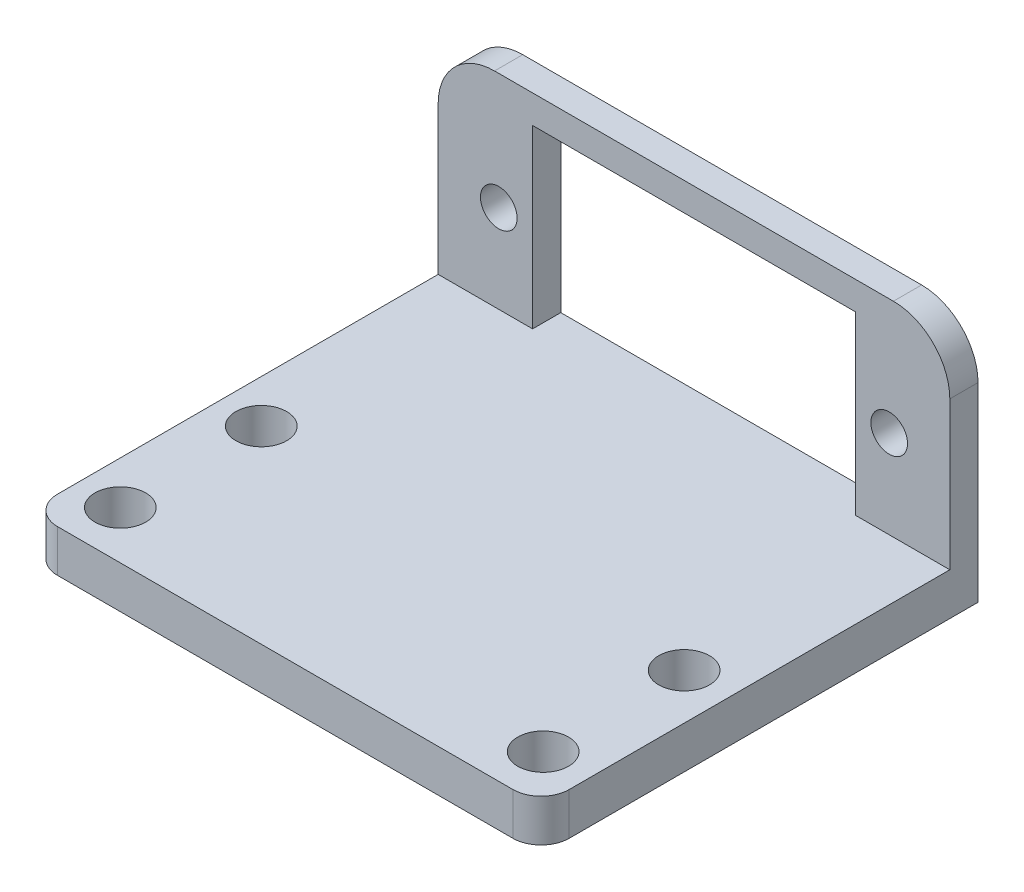
ISO-10303-21;
HEADER;
FILE_DESCRIPTION(('STEP AP214'),'2;1');
FILE_NAME('part.step','',(''),(''),'','','');
FILE_SCHEMA(('AUTOMOTIVE_DESIGN { 1 0 10303 214 1 1 1 1 }'));
ENDSEC;
DATA;
#1=APPLICATION_CONTEXT('core data for automotive mechanical design processes');
#2=APPLICATION_PROTOCOL_DEFINITION('international standard','automotive_design',2000,#1);
#3=PRODUCT_CONTEXT('',#1,'mechanical');
#4=PRODUCT('Part','Part','',(#3));
#5=PRODUCT_RELATED_PRODUCT_CATEGORY('part','',(#4));
#6=PRODUCT_DEFINITION_FORMATION('','',#4);
#7=PRODUCT_DEFINITION_CONTEXT('part definition',#1,'design');
#8=PRODUCT_DEFINITION('design','',#6,#7);
#9=PRODUCT_DEFINITION_SHAPE('','',#8);
#10=(LENGTH_UNIT() NAMED_UNIT(*) SI_UNIT(.MILLI.,.METRE.));
#11=(NAMED_UNIT(*) PLANE_ANGLE_UNIT() SI_UNIT($,.RADIAN.));
#12=(NAMED_UNIT(*) SI_UNIT($,.STERADIAN.) SOLID_ANGLE_UNIT());
#13=UNCERTAINTY_MEASURE_WITH_UNIT(LENGTH_MEASURE(1.E-05),#10,'distance_accuracy_value','');
#14=(GEOMETRIC_REPRESENTATION_CONTEXT(3) GLOBAL_UNCERTAINTY_ASSIGNED_CONTEXT((#13)) GLOBAL_UNIT_ASSIGNED_CONTEXT((#10,
#11,#12)) REPRESENTATION_CONTEXT('',''));
#15=CARTESIAN_POINT('',(0.,0.,0.));
#16=DIRECTION('',(0.,0.,1.));
#17=DIRECTION('',(1.,0.,0.));
#18=AXIS2_PLACEMENT_3D('',#15,#16,#17);
#19=CARTESIAN_POINT('',(0.,0.,2.));
#20=DIRECTION('',(0.,0.,1.));
#21=DIRECTION('',(1.,0.,0.));
#22=AXIS2_PLACEMENT_3D('',#19,#20,#21);
#23=PLANE('',#22);
#24=DIRECTION('',(-1.,0.,0.));
#25=VECTOR('',#24,1.);
#26=CARTESIAN_POINT('',(-0.499999999980162,2.58053188748736,2.));
#27=LINE('',#26,#25);
#28=CARTESIAN_POINT('',(35.8000000000198,2.58053188748736,2.));
#29=VERTEX_POINT('',#28);
#30=CARTESIAN_POINT('',(29.0999950000198,2.58053188748707,2.));
#31=VERTEX_POINT('',#30);
#32=EDGE_CURVE('E175',#29,#31,#27,.T.);
#33=ORIENTED_EDGE('',*,*,#32,.F.);
#34=DIRECTION('',(0.,1.,0.));
#35=VECTOR('',#34,1.);
#36=CARTESIAN_POINT('',(35.8000000000198,17.0805318874871,2.));
#37=LINE('',#36,#35);
#38=CARTESIAN_POINT('',(35.8000000000198,13.0805318874871,2.));
#39=VERTEX_POINT('',#38);
#40=EDGE_CURVE('E266',#29,#39,#37,.T.);
#41=ORIENTED_EDGE('',*,*,#40,.T.);
#42=CARTESIAN_POINT('',(31.8000000000199,13.0805318874871,2.));
#43=DIRECTION('',(0.,0.,1.));
#44=DIRECTION('',(1.,0.,0.));
#45=AXIS2_PLACEMENT_3D('',#42,#43,#44);
#46=CIRCLE('',#45,4.);
#47=CARTESIAN_POINT('',(31.8000000000199,17.0805318874871,2.));
#48=VERTEX_POINT('',#47);
#49=EDGE_CURVE('E295',#39,#48,#46,.T.);
#50=ORIENTED_EDGE('',*,*,#49,.T.);
#51=DIRECTION('',(-1.,0.,0.));
#52=VECTOR('',#51,1.);
#53=CARTESIAN_POINT('',(-0.499999999980162,17.0805318874871,2.));
#54=LINE('',#53,#52);
#55=CARTESIAN_POINT('',(3.50000000001984,17.0805318874871,2.));
#56=VERTEX_POINT('',#55);
#57=EDGE_CURVE('E269',#48,#56,#54,.T.);
#58=ORIENTED_EDGE('',*,*,#57,.T.);
#59=CARTESIAN_POINT('',(3.50000000001984,13.0805318874871,2.));
#60=DIRECTION('',(0.,0.,1.));
#61=DIRECTION('',(1.,0.,0.));
#62=AXIS2_PLACEMENT_3D('',#59,#60,#61);
#63=CIRCLE('',#62,4.);
#64=CARTESIAN_POINT('',(-0.499999999980162,13.0805318874871,2.));
#65=VERTEX_POINT('',#64);
#66=EDGE_CURVE('E292',#56,#65,#63,.T.);
#67=ORIENTED_EDGE('',*,*,#66,.T.);
#68=DIRECTION('',(0.,-1.,0.));
#69=VECTOR('',#68,1.);
#70=CARTESIAN_POINT('',(-0.499999999980162,17.0805318874871,2.));
#71=LINE('',#70,#69);
#72=CARTESIAN_POINT('',(-0.499999999980162,2.58053188748736,2.));
#73=VERTEX_POINT('',#72);
#74=EDGE_CURVE('E262',#65,#73,#71,.T.);
#75=ORIENTED_EDGE('',*,*,#74,.T.);
#76=CARTESIAN_POINT('',(6.20000500001985,2.58053188748707,2.));
#77=VERTEX_POINT('',#76);
#78=EDGE_CURVE('E185',#77,#73,#27,.T.);
#79=ORIENTED_EDGE('',*,*,#78,.F.);
#80=DIRECTION('',(0.,-1.,0.));
#81=VECTOR('',#80,1.);
#82=CARTESIAN_POINT('',(6.20000500001985,15.0805318874871,2.));
#83=LINE('',#82,#81);
#84=CARTESIAN_POINT('',(6.20000500001985,15.0805318874871,2.));
#85=VERTEX_POINT('',#84);
#86=EDGE_CURVE('E223',#85,#77,#83,.T.);
#87=ORIENTED_EDGE('',*,*,#86,.F.);
#88=DIRECTION('',(-1.,0.,0.));
#89=VECTOR('',#88,1.);
#90=CARTESIAN_POINT('',(6.20000500001985,15.0805318874871,2.));
#91=LINE('',#90,#89);
#92=CARTESIAN_POINT('',(29.0999950000198,15.0805318874871,2.));
#93=VERTEX_POINT('',#92);
#94=EDGE_CURVE('E232',#93,#85,#91,.T.);
#95=ORIENTED_EDGE('',*,*,#94,.F.);
#96=DIRECTION('',(0.,1.,0.));
#97=VECTOR('',#96,1.);
#98=CARTESIAN_POINT('',(29.0999950000198,15.0805318874871,2.));
#99=LINE('',#98,#97);
#100=EDGE_CURVE('E227',#31,#93,#99,.T.);
#101=ORIENTED_EDGE('',*,*,#100,.F.);
#102=EDGE_LOOP('',(#33,#41,#50,#58,#67,#75,#79,#87,#95,#101));
#103=FACE_BOUND('',#102,.T.);
#104=CARTESIAN_POINT('',(31.500000000028,8.83053188748702,2.));
#105=DIRECTION('',(0.,0.,1.));
#106=DIRECTION('',(1.,0.,0.));
#107=AXIS2_PLACEMENT_3D('',#104,#105,#106);
#108=CIRCLE('',#107,1.29999999999999);
#109=CARTESIAN_POINT('',(32.800000000028,8.83053188748702,2.));
#110=VERTEX_POINT('',#109);
#111=EDGE_CURVE('E206',#110,#110,#108,.T.);
#112=ORIENTED_EDGE('',*,*,#111,.F.);
#113=EDGE_LOOP('',(#112));
#114=FACE_BOUND('',#113,.T.);
#115=CARTESIAN_POINT('',(3.80000000002798,8.83053188748702,2.));
#116=DIRECTION('',(0.,0.,1.));
#117=DIRECTION('',(1.,0.,0.));
#118=AXIS2_PLACEMENT_3D('',#115,#116,#117);
#119=CIRCLE('',#118,1.29999999999999);
#120=CARTESIAN_POINT('',(5.10000000002796,8.83053188748702,2.));
#121=VERTEX_POINT('',#120);
#122=EDGE_CURVE('E214',#121,#121,#119,.T.);
#123=ORIENTED_EDGE('',*,*,#122,.F.);
#124=EDGE_LOOP('',(#123));
#125=FACE_BOUND('',#124,.T.);
#126=ADVANCED_FACE('F49',(#103,#114,#125),#23,.T.);
#127=CARTESIAN_POINT('',(0.,0.,0.));
#128=DIRECTION('',(0.,0.,1.));
#129=DIRECTION('',(1.,0.,0.));
#130=AXIS2_PLACEMENT_3D('',#127,#128,#129);
#131=PLANE('',#130);
#132=DIRECTION('',(1.,0.,0.));
#133=VECTOR('',#132,1.);
#134=CARTESIAN_POINT('',(6.20000500001985,2.58053188748707,0.));
#135=LINE('',#134,#133);
#136=CARTESIAN_POINT('',(6.20000500001985,2.58053188748707,0.));
#137=VERTEX_POINT('',#136);
#138=CARTESIAN_POINT('',(29.0999950000198,2.58053188748707,0.));
#139=VERTEX_POINT('',#138);
#140=EDGE_CURVE('E239',#137,#139,#135,.T.);
#141=ORIENTED_EDGE('',*,*,#140,.T.);
#142=DIRECTION('',(0.,1.,0.));
#143=VECTOR('',#142,1.);
#144=CARTESIAN_POINT('',(29.0999950000198,15.0805318874871,0.));
#145=LINE('',#144,#143);
#146=CARTESIAN_POINT('',(29.0999950000198,15.0805318874871,0.));
#147=VERTEX_POINT('',#146);
#148=EDGE_CURVE('E242',#139,#147,#145,.T.);
#149=ORIENTED_EDGE('',*,*,#148,.T.);
#150=DIRECTION('',(-1.,0.,0.));
#151=VECTOR('',#150,1.);
#152=CARTESIAN_POINT('',(6.20000500001985,15.0805318874871,0.));
#153=LINE('',#152,#151);
#154=CARTESIAN_POINT('',(6.20000500001985,15.0805318874871,0.));
#155=VERTEX_POINT('',#154);
#156=EDGE_CURVE('E228',#147,#155,#153,.T.);
#157=ORIENTED_EDGE('',*,*,#156,.T.);
#158=DIRECTION('',(0.,-1.,0.));
#159=VECTOR('',#158,1.);
#160=CARTESIAN_POINT('',(6.20000500001985,15.0805318874871,0.));
#161=LINE('',#160,#159);
#162=EDGE_CURVE('E222',#155,#137,#161,.T.);
#163=ORIENTED_EDGE('',*,*,#162,.T.);
#164=EDGE_LOOP('',(#141,#149,#157,#163));
#165=FACE_BOUND('',#164,.T.);
#166=CARTESIAN_POINT('',(31.500000000028,8.83053188748702,0.));
#167=DIRECTION('',(0.,0.,1.));
#168=DIRECTION('',(1.,0.,0.));
#169=AXIS2_PLACEMENT_3D('',#166,#167,#168);
#170=CIRCLE('',#169,1.3);
#171=CARTESIAN_POINT('',(32.800000000028,8.83053188748702,0.));
#172=VERTEX_POINT('',#171);
#173=EDGE_CURVE('E210',#172,#172,#170,.T.);
#174=ORIENTED_EDGE('',*,*,#173,.T.);
#175=EDGE_LOOP('',(#174));
#176=FACE_BOUND('',#175,.T.);
#177=CARTESIAN_POINT('',(3.80000000002798,8.83053188748702,0.));
#178=DIRECTION('',(0.,0.,1.));
#179=DIRECTION('',(1.,0.,0.));
#180=AXIS2_PLACEMENT_3D('',#177,#178,#179);
#181=CIRCLE('',#180,1.3);
#182=CARTESIAN_POINT('',(5.10000000002797,8.83053188748702,0.));
#183=VERTEX_POINT('',#182);
#184=EDGE_CURVE('E218',#183,#183,#181,.T.);
#185=ORIENTED_EDGE('',*,*,#184,.T.);
#186=EDGE_LOOP('',(#185));
#187=FACE_BOUND('',#186,.T.);
#188=CARTESIAN_POINT('',(31.8000000000199,13.0805318874871,0.));
#189=DIRECTION('',(0.,0.,1.));
#190=DIRECTION('',(1.,0.,0.));
#191=AXIS2_PLACEMENT_3D('',#188,#189,#190);
#192=CIRCLE('',#191,4.);
#193=CARTESIAN_POINT('',(31.8000000000199,17.0805318874871,0.));
#194=VERTEX_POINT('',#193);
#195=CARTESIAN_POINT('',(35.8000000000198,13.0805318874871,0.));
#196=VERTEX_POINT('',#195);
#197=EDGE_CURVE('E166',#194,#196,#192,.F.);
#198=ORIENTED_EDGE('',*,*,#197,.T.);
#199=DIRECTION('',(0.,1.,0.));
#200=VECTOR('',#199,1.);
#201=CARTESIAN_POINT('',(35.8000000000198,17.0805318874871,0.));
#202=LINE('',#201,#200);
#203=CARTESIAN_POINT('',(35.8000000000198,-0.419468112512642,0.));
#204=VERTEX_POINT('',#203);
#205=EDGE_CURVE('E152',#204,#196,#202,.T.);
#206=ORIENTED_EDGE('',*,*,#205,.F.);
#207=DIRECTION('',(-1.,0.,0.));
#208=VECTOR('',#207,1.);
#209=CARTESIAN_POINT('',(-0.499999999980161,-0.419468112512642,0.));
#210=LINE('',#209,#208);
#211=CARTESIAN_POINT('',(-0.499999999980161,-0.419468112512642,0.));
#212=VERTEX_POINT('',#211);
#213=EDGE_CURVE('E164',#204,#212,#210,.T.);
#214=ORIENTED_EDGE('',*,*,#213,.T.);
#215=DIRECTION('',(0.,-1.,0.));
#216=VECTOR('',#215,1.);
#217=CARTESIAN_POINT('',(-0.499999999980162,17.0805318874871,0.));
#218=LINE('',#217,#216);
#219=CARTESIAN_POINT('',(-0.499999999980162,13.0805318874871,0.));
#220=VERTEX_POINT('',#219);
#221=EDGE_CURVE('E170',#220,#212,#218,.T.);
#222=ORIENTED_EDGE('',*,*,#221,.F.);
#223=CARTESIAN_POINT('',(3.50000000001984,13.0805318874871,0.));
#224=DIRECTION('',(0.,0.,1.));
#225=DIRECTION('',(1.,0.,0.));
#226=AXIS2_PLACEMENT_3D('',#223,#224,#225);
#227=CIRCLE('',#226,4.);
#228=CARTESIAN_POINT('',(3.50000000001984,17.0805318874871,0.));
#229=VERTEX_POINT('',#228);
#230=EDGE_CURVE('E284',#220,#229,#227,.F.);
#231=ORIENTED_EDGE('',*,*,#230,.T.);
#232=DIRECTION('',(-1.,0.,0.));
#233=VECTOR('',#232,1.);
#234=CARTESIAN_POINT('',(-0.499999999980162,17.0805318874871,0.));
#235=LINE('',#234,#233);
#236=EDGE_CURVE('E169',#194,#229,#235,.T.);
#237=ORIENTED_EDGE('',*,*,#236,.F.);
#238=EDGE_LOOP('',(#198,#206,#214,#222,#231,#237));
#239=FACE_BOUND('',#238,.T.);
#240=ADVANCED_FACE('F162',(#165,#176,#187,#239),#131,.F.);
#241=CARTESIAN_POINT('',(-0.499999999980162,17.0805318874871,2.));
#242=DIRECTION('',(1.,0.,0.));
#243=DIRECTION('',(0.,1.,0.));
#244=AXIS2_PLACEMENT_3D('',#241,#242,#243);
#245=PLANE('',#244);
#246=DIRECTION('',(0.,0.,-1.));
#247=VECTOR('',#246,1.);
#248=CARTESIAN_POINT('',(-0.499999999980161,-0.419468112512642,31.));
#249=LINE('',#248,#247);
#250=CARTESIAN_POINT('',(-0.499999999980161,-0.419468112512642,29.));
#251=VERTEX_POINT('',#250);
#252=EDGE_CURVE('E157',#251,#212,#249,.T.);
#253=ORIENTED_EDGE('',*,*,#252,.F.);
#254=DIRECTION('',(0.,-1.,0.));
#255=VECTOR('',#254,1.);
#256=CARTESIAN_POINT('',(-0.499999999980162,2.58053188748736,29.));
#257=LINE('',#256,#255);
#258=CARTESIAN_POINT('',(-0.499999999980162,2.58053188748736,29.));
#259=VERTEX_POINT('',#258);
#260=EDGE_CURVE('E11',#251,#259,#257,.F.);
#261=ORIENTED_EDGE('',*,*,#260,.T.);
#262=DIRECTION('',(0.,0.,-1.));
#263=VECTOR('',#262,1.);
#264=CARTESIAN_POINT('',(-0.499999999980162,2.58053188748736,31.));
#265=LINE('',#264,#263);
#266=EDGE_CURVE('E198',#259,#73,#265,.T.);
#267=ORIENTED_EDGE('',*,*,#266,.T.);
#268=ORIENTED_EDGE('',*,*,#74,.F.);
#269=DIRECTION('',(0.,0.,-1.));
#270=VECTOR('',#269,1.);
#271=CARTESIAN_POINT('',(-0.499999999980162,13.0805318874871,2.));
#272=LINE('',#271,#270);
#273=EDGE_CURVE('E298',#65,#220,#272,.T.);
#274=ORIENTED_EDGE('',*,*,#273,.T.);
#275=ORIENTED_EDGE('',*,*,#221,.T.);
#276=EDGE_LOOP('',(#253,#261,#267,#268,#274,#275));
#277=FACE_BOUND('',#276,.T.);
#278=ADVANCED_FACE('F469',(#277),#245,.F.);
#279=CARTESIAN_POINT('',(35.8000000000198,17.0805318874871,2.));
#280=DIRECTION('',(-1.,0.,0.));
#281=DIRECTION('',(0.,0.,1.));
#282=AXIS2_PLACEMENT_3D('',#279,#280,#281);
#283=PLANE('',#282);
#284=DIRECTION('',(0.,0.,-1.));
#285=VECTOR('',#284,1.);
#286=CARTESIAN_POINT('',(35.8000000000198,2.58053188748736,31.));
#287=LINE('',#286,#285);
#288=CARTESIAN_POINT('',(35.8000000000198,2.58053188748736,29.));
#289=VERTEX_POINT('',#288);
#290=EDGE_CURVE('E158',#289,#29,#287,.T.);
#291=ORIENTED_EDGE('',*,*,#290,.F.);
#292=DIRECTION('',(0.,1.,0.));
#293=VECTOR('',#292,1.);
#294=CARTESIAN_POINT('',(35.8000000000198,-0.419468112512642,29.));
#295=LINE('',#294,#293);
#296=CARTESIAN_POINT('',(35.8000000000198,-0.419468112512642,29.));
#297=VERTEX_POINT('',#296);
#298=EDGE_CURVE('E73',#289,#297,#295,.F.);
#299=ORIENTED_EDGE('',*,*,#298,.T.);
#300=DIRECTION('',(0.,0.,-1.));
#301=VECTOR('',#300,1.);
#302=CARTESIAN_POINT('',(35.8000000000198,-0.419468112512642,31.));
#303=LINE('',#302,#301);
#304=EDGE_CURVE('E148',#297,#204,#303,.T.);
#305=ORIENTED_EDGE('',*,*,#304,.T.);
#306=ORIENTED_EDGE('',*,*,#205,.T.);
#307=DIRECTION('',(0.,0.,-1.));
#308=VECTOR('',#307,1.);
#309=CARTESIAN_POINT('',(35.8000000000198,13.0805318874871,2.));
#310=LINE('',#309,#308);
#311=EDGE_CURVE('E289',#196,#39,#310,.F.);
#312=ORIENTED_EDGE('',*,*,#311,.T.);
#313=ORIENTED_EDGE('',*,*,#40,.F.);
#314=EDGE_LOOP('',(#291,#299,#305,#306,#312,#313));
#315=FACE_BOUND('',#314,.T.);
#316=ADVANCED_FACE('F150',(#315),#283,.F.);
#317=CARTESIAN_POINT('',(-0.499999999980162,17.0805318874871,2.));
#318=DIRECTION('',(0.,-1.,0.));
#319=DIRECTION('',(0.,0.,-1.));
#320=AXIS2_PLACEMENT_3D('',#317,#318,#319);
#321=PLANE('',#320);
#322=ORIENTED_EDGE('',*,*,#57,.F.);
#323=DIRECTION('',(0.,0.,-1.));
#324=VECTOR('',#323,1.);
#325=CARTESIAN_POINT('',(31.8000000000199,17.0805318874871,2.));
#326=LINE('',#325,#324);
#327=EDGE_CURVE('E280',#48,#194,#326,.T.);
#328=ORIENTED_EDGE('',*,*,#327,.T.);
#329=ORIENTED_EDGE('',*,*,#236,.T.);
#330=DIRECTION('',(0.,0.,-1.));
#331=VECTOR('',#330,1.);
#332=CARTESIAN_POINT('',(3.50000000001984,17.0805318874871,2.));
#333=LINE('',#332,#331);
#334=EDGE_CURVE('E273',#229,#56,#333,.F.);
#335=ORIENTED_EDGE('',*,*,#334,.T.);
#336=EDGE_LOOP('',(#322,#328,#329,#335));
#337=FACE_BOUND('',#336,.T.);
#338=ADVANCED_FACE('F473',(#337),#321,.F.);
#339=CARTESIAN_POINT('',(6.20000500001985,15.0805318874871,2.));
#340=DIRECTION('',(1.,0.,0.));
#341=DIRECTION('',(0.,0.,-1.));
#342=AXIS2_PLACEMENT_3D('',#339,#340,#341);
#343=PLANE('',#342);
#344=ORIENTED_EDGE('',*,*,#162,.F.);
#345=DIRECTION('',(0.,0.,-1.));
#346=VECTOR('',#345,1.);
#347=CARTESIAN_POINT('',(6.20000500001985,15.0805318874871,2.));
#348=LINE('',#347,#346);
#349=EDGE_CURVE('E235',#85,#155,#348,.T.);
#350=ORIENTED_EDGE('',*,*,#349,.F.);
#351=ORIENTED_EDGE('',*,*,#86,.T.);
#352=DIRECTION('',(0.,0.,-1.));
#353=VECTOR('',#352,1.);
#354=CARTESIAN_POINT('',(6.20000500001985,2.58053188748707,2.));
#355=LINE('',#354,#353);
#356=EDGE_CURVE('E258',#77,#137,#355,.T.);
#357=ORIENTED_EDGE('',*,*,#356,.T.);
#358=EDGE_LOOP('',(#344,#350,#351,#357));
#359=FACE_BOUND('',#358,.T.);
#360=ADVANCED_FACE('F347',(#359),#343,.T.);
#361=CARTESIAN_POINT('',(6.20000500001985,2.58053188748707,2.));
#362=DIRECTION('',(0.,1.,0.));
#363=DIRECTION('',(0.,0.,1.));
#364=AXIS2_PLACEMENT_3D('',#361,#362,#363);
#365=PLANE('',#364);
#366=CARTESIAN_POINT('',(2.55000500003894,2.58053188748707,17.6000000000099));
#367=DIRECTION('',(0.,1.,0.));
#368=DIRECTION('',(0.,0.,1.));
#369=AXIS2_PLACEMENT_3D('',#366,#367,#368);
#370=CIRCLE('',#369,1.79999999999999);
#371=CARTESIAN_POINT('',(2.55000500003894,2.58053188748707,19.4000000000099));
#372=VERTEX_POINT('',#371);
#373=EDGE_CURVE('E426',#372,#372,#370,.T.);
#374=ORIENTED_EDGE('',*,*,#373,.F.);
#375=EDGE_LOOP('',(#374));
#376=FACE_BOUND('',#375,.T.);
#377=CARTESIAN_POINT('',(2.55000500003894,2.58053188748707,27.6000000000099));
#378=DIRECTION('',(0.,1.,0.));
#379=DIRECTION('',(0.,0.,1.));
#380=AXIS2_PLACEMENT_3D('',#377,#378,#379);
#381=CIRCLE('',#380,1.79999999999999);
#382=CARTESIAN_POINT('',(2.55000500003894,2.58053188748707,29.4000000000099));
#383=VERTEX_POINT('',#382);
#384=EDGE_CURVE('E404',#383,#383,#381,.T.);
#385=ORIENTED_EDGE('',*,*,#384,.F.);
#386=EDGE_LOOP('',(#385));
#387=FACE_BOUND('',#386,.T.);
#388=CARTESIAN_POINT('',(32.5500050000389,2.58053188748707,17.6000000000099));
#389=DIRECTION('',(0.,1.,0.));
#390=DIRECTION('',(0.,0.,1.));
#391=AXIS2_PLACEMENT_3D('',#388,#389,#390);
#392=CIRCLE('',#391,1.79999999999999);
#393=CARTESIAN_POINT('',(32.5500050000389,2.58053188748707,19.4000000000099));
#394=VERTEX_POINT('',#393);
#395=EDGE_CURVE('E378',#394,#394,#392,.T.);
#396=ORIENTED_EDGE('',*,*,#395,.F.);
#397=EDGE_LOOP('',(#396));
#398=FACE_BOUND('',#397,.T.);
#399=CARTESIAN_POINT('',(32.5500050000382,2.58053188748707,27.6000000000077));
#400=DIRECTION('',(0.,1.,0.));
#401=DIRECTION('',(0.,0.,1.));
#402=AXIS2_PLACEMENT_3D('',#399,#400,#401);
#403=CIRCLE('',#402,1.79999999999999);
#404=CARTESIAN_POINT('',(32.5500050000382,2.58053188748707,29.4000000000077));
#405=VERTEX_POINT('',#404);
#406=EDGE_CURVE('E188',#405,#405,#403,.T.);
#407=ORIENTED_EDGE('',*,*,#406,.F.);
#408=EDGE_LOOP('',(#407));
#409=FACE_BOUND('',#408,.T.);
#410=DIRECTION('',(-1.,0.,0.));
#411=VECTOR('',#410,1.);
#412=CARTESIAN_POINT('',(-0.499999999980162,2.58053188748736,31.));
#413=LINE('',#412,#411);
#414=CARTESIAN_POINT('',(33.8000000000198,2.58053188748736,31.));
#415=VERTEX_POINT('',#414);
#416=CARTESIAN_POINT('',(1.50000000001984,2.58053188748736,31.));
#417=VERTEX_POINT('',#416);
#418=EDGE_CURVE('E195',#415,#417,#413,.T.);
#419=ORIENTED_EDGE('',*,*,#418,.F.);
#420=CARTESIAN_POINT('',(33.8000000000198,2.58053188748707,29.));
#421=DIRECTION('',(0.,1.,0.));
#422=DIRECTION('',(0.,0.,1.));
#423=AXIS2_PLACEMENT_3D('',#420,#421,#422);
#424=CIRCLE('',#423,2.);
#425=EDGE_CURVE('E313',#415,#289,#424,.T.);
#426=ORIENTED_EDGE('',*,*,#425,.T.);
#427=ORIENTED_EDGE('',*,*,#290,.T.);
#428=ORIENTED_EDGE('',*,*,#32,.T.);
#429=DIRECTION('',(0.,0.,-1.));
#430=VECTOR('',#429,1.);
#431=CARTESIAN_POINT('',(29.0999950000198,2.58053188748707,2.));
#432=LINE('',#431,#430);
#433=EDGE_CURVE('E255',#31,#139,#432,.T.);
#434=ORIENTED_EDGE('',*,*,#433,.T.);
#435=ORIENTED_EDGE('',*,*,#140,.F.);
#436=ORIENTED_EDGE('',*,*,#356,.F.);
#437=ORIENTED_EDGE('',*,*,#78,.T.);
#438=ORIENTED_EDGE('',*,*,#266,.F.);
#439=CARTESIAN_POINT('',(1.50000000001984,2.58053188748707,29.));
#440=DIRECTION('',(0.,1.,0.));
#441=DIRECTION('',(0.,0.,1.));
#442=AXIS2_PLACEMENT_3D('',#439,#440,#441);
#443=CIRCLE('',#442,2.);
#444=EDGE_CURVE('E310',#259,#417,#443,.T.);
#445=ORIENTED_EDGE('',*,*,#444,.T.);
#446=EDGE_LOOP('',(#419,#426,#427,#428,#434,#435,#436,#437,#438,#445));
#447=FACE_BOUND('',#446,.T.);
#448=ADVANCED_FACE('F329',(#376,#387,#398,#409,#447),#365,.T.);
#449=CARTESIAN_POINT('',(29.0999950000198,15.0805318874871,2.));
#450=DIRECTION('',(-1.,0.,0.));
#451=DIRECTION('',(0.,0.,1.));
#452=AXIS2_PLACEMENT_3D('',#449,#450,#451);
#453=PLANE('',#452);
#454=ORIENTED_EDGE('',*,*,#148,.F.);
#455=ORIENTED_EDGE('',*,*,#433,.F.);
#456=ORIENTED_EDGE('',*,*,#100,.T.);
#457=DIRECTION('',(0.,0.,-1.));
#458=VECTOR('',#457,1.);
#459=CARTESIAN_POINT('',(29.0999950000198,15.0805318874871,2.));
#460=LINE('',#459,#458);
#461=EDGE_CURVE('E252',#93,#147,#460,.T.);
#462=ORIENTED_EDGE('',*,*,#461,.T.);
#463=EDGE_LOOP('',(#454,#455,#456,#462));
#464=FACE_BOUND('',#463,.T.);
#465=ADVANCED_FACE('F341',(#464),#453,.T.);
#466=CARTESIAN_POINT('',(6.20000500001985,15.0805318874871,2.));
#467=DIRECTION('',(0.,-1.,0.));
#468=DIRECTION('',(0.,0.,-1.));
#469=AXIS2_PLACEMENT_3D('',#466,#467,#468);
#470=PLANE('',#469);
#471=ORIENTED_EDGE('',*,*,#156,.F.);
#472=ORIENTED_EDGE('',*,*,#461,.F.);
#473=ORIENTED_EDGE('',*,*,#94,.T.);
#474=ORIENTED_EDGE('',*,*,#349,.T.);
#475=EDGE_LOOP('',(#471,#472,#473,#474));
#476=FACE_BOUND('',#475,.T.);
#477=ADVANCED_FACE('F350',(#476),#470,.T.);
#478=CARTESIAN_POINT('',(31.8000000000199,13.0805318874871,2.));
#479=DIRECTION('',(0.,0.,-1.));
#480=DIRECTION('',(-1.,0.,0.));
#481=AXIS2_PLACEMENT_3D('',#478,#479,#480);
#482=CYLINDRICAL_SURFACE('',#481,4.);
#483=ORIENTED_EDGE('',*,*,#49,.F.);
#484=ORIENTED_EDGE('',*,*,#311,.F.);
#485=ORIENTED_EDGE('',*,*,#197,.F.);
#486=ORIENTED_EDGE('',*,*,#327,.F.);
#487=EDGE_LOOP('',(#483,#484,#485,#486));
#488=FACE_BOUND('',#487,.T.);
#489=ADVANCED_FACE('F482',(#488),#482,.T.);
#490=CARTESIAN_POINT('',(3.50000000001984,13.0805318874871,2.));
#491=DIRECTION('',(0.,0.,-1.));
#492=DIRECTION('',(-1.,0.,0.));
#493=AXIS2_PLACEMENT_3D('',#490,#491,#492);
#494=CYLINDRICAL_SURFACE('',#493,4.);
#495=ORIENTED_EDGE('',*,*,#66,.F.);
#496=ORIENTED_EDGE('',*,*,#334,.F.);
#497=ORIENTED_EDGE('',*,*,#230,.F.);
#498=ORIENTED_EDGE('',*,*,#273,.F.);
#499=EDGE_LOOP('',(#495,#496,#497,#498));
#500=FACE_BOUND('',#499,.T.);
#501=ADVANCED_FACE('F485',(#500),#494,.T.);
#502=CARTESIAN_POINT('',(3.80000000002798,8.83053188748702,2.));
#503=DIRECTION('',(0.,0.,1.));
#504=DIRECTION('',(1.,0.,0.));
#505=AXIS2_PLACEMENT_3D('',#502,#503,#504);
#506=CYLINDRICAL_SURFACE('',#505,1.29999999999999);
#507=ORIENTED_EDGE('',*,*,#184,.F.);
#508=EDGE_LOOP('',(#507));
#509=FACE_BOUND('',#508,.T.);
#510=ORIENTED_EDGE('',*,*,#122,.T.);
#511=EDGE_LOOP('',(#510));
#512=FACE_BOUND('',#511,.T.);
#513=ADVANCED_FACE('F488',(#509,#512),#506,.F.);
#514=CARTESIAN_POINT('',(31.500000000028,8.83053188748702,2.));
#515=DIRECTION('',(0.,0.,1.));
#516=DIRECTION('',(1.,0.,0.));
#517=AXIS2_PLACEMENT_3D('',#514,#515,#516);
#518=CYLINDRICAL_SURFACE('',#517,1.3);
#519=ORIENTED_EDGE('',*,*,#173,.F.);
#520=EDGE_LOOP('',(#519));
#521=FACE_BOUND('',#520,.T.);
#522=ORIENTED_EDGE('',*,*,#111,.T.);
#523=EDGE_LOOP('',(#522));
#524=FACE_BOUND('',#523,.T.);
#525=ADVANCED_FACE('F495',(#521,#524),#518,.F.);
#526=CARTESIAN_POINT('',(-0.499999999980161,-0.419468112512642,31.));
#527=DIRECTION('',(0.,1.,0.));
#528=DIRECTION('',(0.,0.,1.));
#529=AXIS2_PLACEMENT_3D('',#526,#527,#528);
#530=PLANE('',#529);
#531=CARTESIAN_POINT('',(2.55000500003894,-0.419468112512933,17.6000000000099));
#532=DIRECTION('',(0.,1.,0.));
#533=DIRECTION('',(0.,0.,1.));
#534=AXIS2_PLACEMENT_3D('',#531,#532,#533);
#535=CIRCLE('',#534,1.8);
#536=CARTESIAN_POINT('',(2.55000500003894,-0.419468112512933,19.4000000000099));
#537=VERTEX_POINT('',#536);
#538=EDGE_CURVE('E409',#537,#537,#535,.T.);
#539=ORIENTED_EDGE('',*,*,#538,.T.);
#540=EDGE_LOOP('',(#539));
#541=FACE_BOUND('',#540,.T.);
#542=CARTESIAN_POINT('',(2.55000500003894,-0.419468112512933,27.6000000000099));
#543=DIRECTION('',(0.,1.,0.));
#544=DIRECTION('',(0.,0.,1.));
#545=AXIS2_PLACEMENT_3D('',#542,#543,#544);
#546=CIRCLE('',#545,1.8);
#547=CARTESIAN_POINT('',(2.55000500003894,-0.419468112512933,29.4000000000099));
#548=VERTEX_POINT('',#547);
#549=EDGE_CURVE('E408',#548,#548,#546,.T.);
#550=ORIENTED_EDGE('',*,*,#549,.T.);
#551=EDGE_LOOP('',(#550));
#552=FACE_BOUND('',#551,.T.);
#553=CARTESIAN_POINT('',(32.5500050000389,-0.419468112512933,17.6000000000099));
#554=DIRECTION('',(0.,1.,0.));
#555=DIRECTION('',(0.,0.,1.));
#556=AXIS2_PLACEMENT_3D('',#553,#554,#555);
#557=CIRCLE('',#556,1.8);
#558=CARTESIAN_POINT('',(32.5500050000389,-0.419468112512933,19.4000000000099));
#559=VERTEX_POINT('',#558);
#560=EDGE_CURVE('E375',#559,#559,#557,.T.);
#561=ORIENTED_EDGE('',*,*,#560,.T.);
#562=EDGE_LOOP('',(#561));
#563=FACE_BOUND('',#562,.T.);
#564=CARTESIAN_POINT('',(32.5500050000382,-0.419468112512933,27.6000000000077));
#565=DIRECTION('',(0.,1.,0.));
#566=DIRECTION('',(0.,0.,1.));
#567=AXIS2_PLACEMENT_3D('',#564,#565,#566);
#568=CIRCLE('',#567,1.8);
#569=CARTESIAN_POINT('',(32.5500050000382,-0.419468112512933,29.4000000000077));
#570=VERTEX_POINT('',#569);
#571=EDGE_CURVE('E176',#570,#570,#568,.T.);
#572=ORIENTED_EDGE('',*,*,#571,.T.);
#573=EDGE_LOOP('',(#572));
#574=FACE_BOUND('',#573,.T.);
#575=ORIENTED_EDGE('',*,*,#304,.F.);
#576=CARTESIAN_POINT('',(33.8000000000198,-0.419468112512642,29.));
#577=DIRECTION('',(0.,1.,0.));
#578=DIRECTION('',(0.,0.,1.));
#579=AXIS2_PLACEMENT_3D('',#576,#577,#578);
#580=CIRCLE('',#579,2.);
#581=CARTESIAN_POINT('',(33.8000000000198,-0.419468112512642,31.));
#582=VERTEX_POINT('',#581);
#583=EDGE_CURVE('E58',#297,#582,#580,.F.);
#584=ORIENTED_EDGE('',*,*,#583,.T.);
#585=DIRECTION('',(1.,0.,0.));
#586=VECTOR('',#585,1.);
#587=CARTESIAN_POINT('',(-0.499999999980161,-0.419468112512642,31.));
#588=LINE('',#587,#586);
#589=CARTESIAN_POINT('',(1.50000000001984,-0.419468112512642,31.));
#590=VERTEX_POINT('',#589);
#591=EDGE_CURVE('E183',#590,#582,#588,.T.);
#592=ORIENTED_EDGE('',*,*,#591,.F.);
#593=CARTESIAN_POINT('',(1.50000000001984,-0.419468112512642,29.));
#594=DIRECTION('',(0.,1.,0.));
#595=DIRECTION('',(0.,0.,1.));
#596=AXIS2_PLACEMENT_3D('',#593,#594,#595);
#597=CIRCLE('',#596,2.);
#598=EDGE_CURVE('E65',#590,#251,#597,.F.);
#599=ORIENTED_EDGE('',*,*,#598,.T.);
#600=ORIENTED_EDGE('',*,*,#252,.T.);
#601=ORIENTED_EDGE('',*,*,#213,.F.);
#602=EDGE_LOOP('',(#575,#584,#592,#599,#600,#601));
#603=FACE_BOUND('',#602,.T.);
#604=ADVANCED_FACE('F172',(#541,#552,#563,#574,#603),#530,.F.);
#605=CARTESIAN_POINT('',(0.,0.,31.));
#606=DIRECTION('',(0.,0.,1.));
#607=DIRECTION('',(1.,0.,0.));
#608=AXIS2_PLACEMENT_3D('',#605,#606,#607);
#609=PLANE('',#608);
#610=ORIENTED_EDGE('',*,*,#591,.T.);
#611=DIRECTION('',(0.,1.,0.));
#612=VECTOR('',#611,1.);
#613=CARTESIAN_POINT('',(33.8000000000198,2.58053188748736,31.));
#614=LINE('',#613,#612);
#615=EDGE_CURVE('E306',#582,#415,#614,.T.);
#616=ORIENTED_EDGE('',*,*,#615,.T.);
#617=ORIENTED_EDGE('',*,*,#418,.T.);
#618=DIRECTION('',(0.,-1.,0.));
#619=VECTOR('',#618,1.);
#620=CARTESIAN_POINT('',(1.50000000001984,-0.419468112512642,31.));
#621=LINE('',#620,#619);
#622=EDGE_CURVE('E302',#417,#590,#621,.T.);
#623=ORIENTED_EDGE('',*,*,#622,.T.);
#624=EDGE_LOOP('',(#610,#616,#617,#623));
#625=FACE_BOUND('',#624,.T.);
#626=ADVANCED_FACE('F324',(#625),#609,.T.);
#627=CARTESIAN_POINT('',(33.8000000000198,0.,29.));
#628=DIRECTION('',(0.,-1.,0.));
#629=DIRECTION('',(0.,0.,-1.));
#630=AXIS2_PLACEMENT_3D('',#627,#628,#629);
#631=CYLINDRICAL_SURFACE('',#630,2.);
#632=ORIENTED_EDGE('',*,*,#583,.F.);
#633=ORIENTED_EDGE('',*,*,#298,.F.);
#634=ORIENTED_EDGE('',*,*,#425,.F.);
#635=ORIENTED_EDGE('',*,*,#615,.F.);
#636=EDGE_LOOP('',(#632,#633,#634,#635));
#637=FACE_BOUND('',#636,.T.);
#638=ADVANCED_FACE('F327',(#637),#631,.T.);
#639=CARTESIAN_POINT('',(1.50000000001984,0.,29.));
#640=DIRECTION('',(0.,1.,0.));
#641=DIRECTION('',(-1.,0.,0.));
#642=AXIS2_PLACEMENT_3D('',#639,#640,#641);
#643=CYLINDRICAL_SURFACE('',#642,2.);
#644=ORIENTED_EDGE('',*,*,#444,.F.);
#645=ORIENTED_EDGE('',*,*,#260,.F.);
#646=ORIENTED_EDGE('',*,*,#598,.F.);
#647=ORIENTED_EDGE('',*,*,#622,.F.);
#648=EDGE_LOOP('',(#644,#645,#646,#647));
#649=FACE_BOUND('',#648,.T.);
#650=ADVANCED_FACE('F51',(#649),#643,.T.);
#651=CARTESIAN_POINT('',(32.5500050000382,2.58053188748707,27.6000000000077));
#652=DIRECTION('',(0.,1.,0.));
#653=DIRECTION('',(0.,0.,1.));
#654=AXIS2_PLACEMENT_3D('',#651,#652,#653);
#655=CYLINDRICAL_SURFACE('',#654,1.79999999999999);
#656=ORIENTED_EDGE('',*,*,#571,.F.);
#657=EDGE_LOOP('',(#656));
#658=FACE_BOUND('',#657,.T.);
#659=ORIENTED_EDGE('',*,*,#406,.T.);
#660=EDGE_LOOP('',(#659));
#661=FACE_BOUND('',#660,.T.);
#662=ADVANCED_FACE('F452',(#658,#661),#655,.F.);
#663=CARTESIAN_POINT('',(32.5500050000389,2.58053188748707,17.6000000000099));
#664=DIRECTION('',(0.,1.,0.));
#665=DIRECTION('',(0.,0.,1.));
#666=AXIS2_PLACEMENT_3D('',#663,#664,#665);
#667=CYLINDRICAL_SURFACE('',#666,1.79999999999999);
#668=ORIENTED_EDGE('',*,*,#560,.F.);
#669=EDGE_LOOP('',(#668));
#670=FACE_BOUND('',#669,.T.);
#671=ORIENTED_EDGE('',*,*,#395,.T.);
#672=EDGE_LOOP('',(#671));
#673=FACE_BOUND('',#672,.T.);
#674=ADVANCED_FACE('F454',(#670,#673),#667,.F.);
#675=CARTESIAN_POINT('',(2.55000500003894,2.58053188748707,27.6000000000099));
#676=DIRECTION('',(0.,1.,0.));
#677=DIRECTION('',(0.,0.,1.));
#678=AXIS2_PLACEMENT_3D('',#675,#676,#677);
#679=CYLINDRICAL_SURFACE('',#678,1.79999999999999);
#680=ORIENTED_EDGE('',*,*,#549,.F.);
#681=EDGE_LOOP('',(#680));
#682=FACE_BOUND('',#681,.T.);
#683=ORIENTED_EDGE('',*,*,#384,.T.);
#684=EDGE_LOOP('',(#683));
#685=FACE_BOUND('',#684,.T.);
#686=ADVANCED_FACE('F439',(#682,#685),#679,.F.);
#687=CARTESIAN_POINT('',(2.55000500003894,2.58053188748707,17.6000000000099));
#688=DIRECTION('',(0.,1.,0.));
#689=DIRECTION('',(0.,0.,1.));
#690=AXIS2_PLACEMENT_3D('',#687,#688,#689);
#691=CYLINDRICAL_SURFACE('',#690,1.79999999999999);
#692=ORIENTED_EDGE('',*,*,#538,.F.);
#693=EDGE_LOOP('',(#692));
#694=FACE_BOUND('',#693,.T.);
#695=ORIENTED_EDGE('',*,*,#373,.T.);
#696=EDGE_LOOP('',(#695));
#697=FACE_BOUND('',#696,.T.);
#698=ADVANCED_FACE('F436',(#694,#697),#691,.F.);
#699=CLOSED_SHELL('',(#126,#240,#278,#316,#338,#360,#448,#465,#477,#489,#501,#513,#525,#604,
#626,#638,#650,#662,#674,#686,#698));
#700=MANIFOLD_SOLID_BREP('B2',#699);
#701=ADVANCED_BREP_SHAPE_REPRESENTATION('',(#18,#700),#14);
#702=SHAPE_DEFINITION_REPRESENTATION(#9,#701);
ENDSEC;
END-ISO-10303-21;
